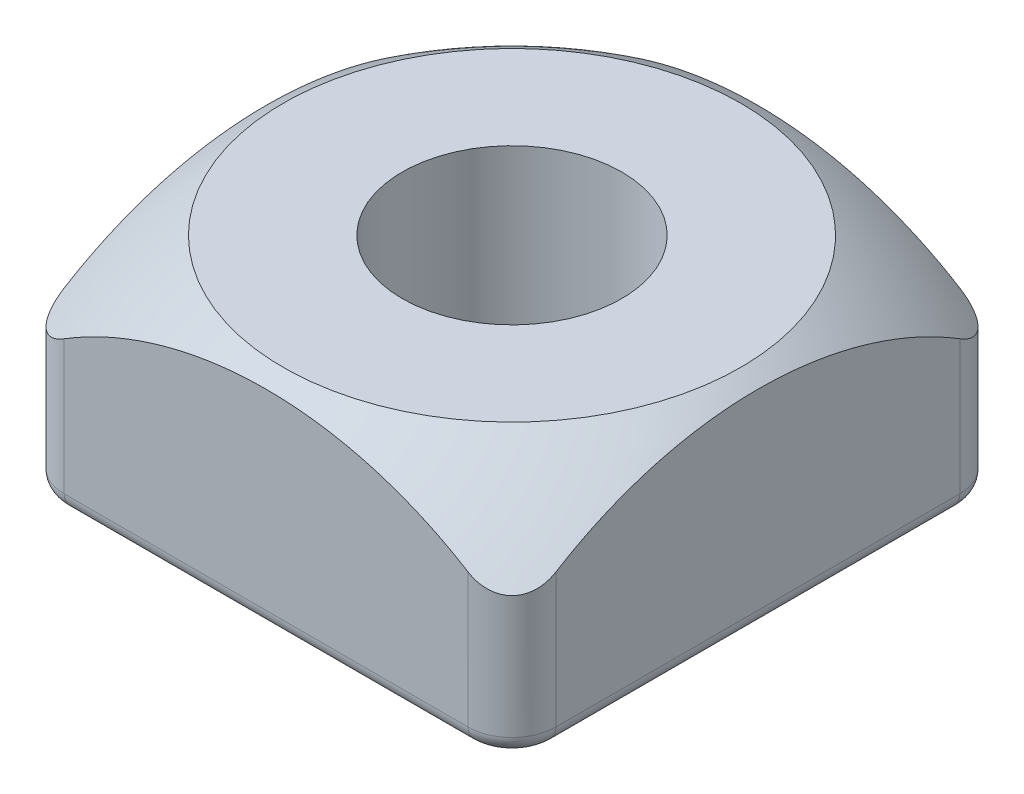
ISO-10303-21;
HEADER;
FILE_DESCRIPTION(('STEP AP214'),'2;1');
FILE_NAME('part.step','',(''),(''),'','','');
FILE_SCHEMA(('AUTOMOTIVE_DESIGN { 1 0 10303 214 1 1 1 1 }'));
ENDSEC;
DATA;
#1=APPLICATION_CONTEXT('core data for automotive mechanical design processes');
#2=APPLICATION_PROTOCOL_DEFINITION('international standard','automotive_design',2000,#1);
#3=PRODUCT_CONTEXT('',#1,'mechanical');
#4=PRODUCT('Part','Part','',(#3));
#5=PRODUCT_RELATED_PRODUCT_CATEGORY('part','',(#4));
#6=PRODUCT_DEFINITION_FORMATION('','',#4);
#7=PRODUCT_DEFINITION_CONTEXT('part definition',#1,'design');
#8=PRODUCT_DEFINITION('design','',#6,#7);
#9=PRODUCT_DEFINITION_SHAPE('','',#8);
#10=(LENGTH_UNIT() NAMED_UNIT(*) SI_UNIT(.MILLI.,.METRE.));
#11=(NAMED_UNIT(*) PLANE_ANGLE_UNIT() SI_UNIT($,.RADIAN.));
#12=(NAMED_UNIT(*) SI_UNIT($,.STERADIAN.) SOLID_ANGLE_UNIT());
#13=UNCERTAINTY_MEASURE_WITH_UNIT(LENGTH_MEASURE(1.E-05),#10,'distance_accuracy_value','');
#14=(GEOMETRIC_REPRESENTATION_CONTEXT(3) GLOBAL_UNCERTAINTY_ASSIGNED_CONTEXT((#13)) GLOBAL_UNIT_ASSIGNED_CONTEXT((#10,
#11,#12)) REPRESENTATION_CONTEXT('',''));
#15=CARTESIAN_POINT('',(0.,0.,0.));
#16=DIRECTION('',(0.,0.,1.));
#17=DIRECTION('',(1.,0.,0.));
#18=AXIS2_PLACEMENT_3D('',#15,#16,#17);
#19=CARTESIAN_POINT('',(-2.8,2.5,2.8));
#20=DIRECTION('',(1.,0.,0.));
#21=DIRECTION('',(0.,0.,-1.));
#22=AXIS2_PLACEMENT_3D('',#19,#20,#21);
#23=PLANE('',#22);
#24=CARTESIAN_POINT('',(-2.8,-2.,0.));
#25=DIRECTION('',(1.,0.,0.));
#26=DIRECTION('',(0.,0.,-1.));
#27=AXIS2_PLACEMENT_3D('',#24,#25,#26);
#28=CIRCLE('',#27,4.38178046004133);
#29=CARTESIAN_POINT('',(-2.8,1.7296112397943,-2.3));
#30=VERTEX_POINT('',#29);
#31=CARTESIAN_POINT('',(-2.8,1.7296112397943,2.3));
#32=VERTEX_POINT('',#31);
#33=EDGE_CURVE('E247',#30,#32,#28,.T.);
#34=ORIENTED_EDGE('',*,*,#33,.F.);
#35=DIRECTION('',(0.,-1.,0.));
#36=VECTOR('',#35,1.);
#37=CARTESIAN_POINT('',(-2.8,2.5,-2.3));
#38=LINE('',#37,#36);
#39=CARTESIAN_POINT('',(-2.8,0.2,-2.3));
#40=VERTEX_POINT('',#39);
#41=EDGE_CURVE('E218',#30,#40,#38,.T.);
#42=ORIENTED_EDGE('',*,*,#41,.T.);
#43=DIRECTION('',(0.,0.,1.));
#44=VECTOR('',#43,1.);
#45=CARTESIAN_POINT('',(-2.8,0.2,2.8));
#46=LINE('',#45,#44);
#47=CARTESIAN_POINT('',(-2.8,0.2,2.3));
#48=VERTEX_POINT('',#47);
#49=EDGE_CURVE('E160',#40,#48,#46,.T.);
#50=ORIENTED_EDGE('',*,*,#49,.T.);
#51=DIRECTION('',(0.,-1.,0.));
#52=VECTOR('',#51,1.);
#53=CARTESIAN_POINT('',(-2.8,2.5,2.3));
#54=LINE('',#53,#52);
#55=EDGE_CURVE('E206',#48,#32,#54,.F.);
#56=ORIENTED_EDGE('',*,*,#55,.T.);
#57=EDGE_LOOP('',(#34,#42,#50,#56));
#58=FACE_BOUND('',#57,.T.);
#59=ADVANCED_FACE('F17',(#58),#23,.F.);
#60=CARTESIAN_POINT('',(2.8,2.5,2.8));
#61=DIRECTION('',(0.,0.,-1.));
#62=DIRECTION('',(-1.,0.,0.));
#63=AXIS2_PLACEMENT_3D('',#60,#61,#62);
#64=PLANE('',#63);
#65=CARTESIAN_POINT('',(0.,-2.,2.8));
#66=DIRECTION('',(0.,0.,-1.));
#67=DIRECTION('',(-1.,0.,0.));
#68=AXIS2_PLACEMENT_3D('',#65,#66,#67);
#69=CIRCLE('',#68,4.38178046004133);
#70=CARTESIAN_POINT('',(-2.3,1.7296112397943,2.8));
#71=VERTEX_POINT('',#70);
#72=CARTESIAN_POINT('',(2.3,1.7296112397943,2.8));
#73=VERTEX_POINT('',#72);
#74=EDGE_CURVE('E38',#71,#73,#69,.T.);
#75=ORIENTED_EDGE('',*,*,#74,.F.);
#76=DIRECTION('',(0.,-1.,0.));
#77=VECTOR('',#76,1.);
#78=CARTESIAN_POINT('',(-2.3,2.5,2.8));
#79=LINE('',#78,#77);
#80=CARTESIAN_POINT('',(-2.3,0.2,2.8));
#81=VERTEX_POINT('',#80);
#82=EDGE_CURVE('E138',#71,#81,#79,.T.);
#83=ORIENTED_EDGE('',*,*,#82,.T.);
#84=DIRECTION('',(1.,0.,0.));
#85=VECTOR('',#84,1.);
#86=CARTESIAN_POINT('',(2.8,0.2,2.8));
#87=LINE('',#86,#85);
#88=CARTESIAN_POINT('',(2.3,0.2,2.8));
#89=VERTEX_POINT('',#88);
#90=EDGE_CURVE('E31',#81,#89,#87,.T.);
#91=ORIENTED_EDGE('',*,*,#90,.T.);
#92=DIRECTION('',(0.,-1.,0.));
#93=VECTOR('',#92,1.);
#94=CARTESIAN_POINT('',(2.3,2.5,2.8));
#95=LINE('',#94,#93);
#96=EDGE_CURVE('E130',#89,#73,#95,.F.);
#97=ORIENTED_EDGE('',*,*,#96,.T.);
#98=EDGE_LOOP('',(#75,#83,#91,#97));
#99=FACE_BOUND('',#98,.T.);
#100=ADVANCED_FACE('F289',(#99),#64,.F.);
#101=CARTESIAN_POINT('',(2.8,2.5,2.8));
#102=DIRECTION('',(-1.,0.,0.));
#103=DIRECTION('',(0.,0.,1.));
#104=AXIS2_PLACEMENT_3D('',#101,#102,#103);
#105=PLANE('',#104);
#106=CARTESIAN_POINT('',(2.8,-2.,0.));
#107=DIRECTION('',(-1.,0.,0.));
#108=DIRECTION('',(0.,0.,1.));
#109=AXIS2_PLACEMENT_3D('',#106,#107,#108);
#110=CIRCLE('',#109,4.38178046004133);
#111=CARTESIAN_POINT('',(2.8,1.72961123979471,2.29999999999933));
#112=VERTEX_POINT('',#111);
#113=CARTESIAN_POINT('',(2.8,1.7296112397943,-2.3));
#114=VERTEX_POINT('',#113);
#115=EDGE_CURVE('E111',#112,#114,#110,.T.);
#116=ORIENTED_EDGE('',*,*,#115,.F.);
#117=DIRECTION('',(0.,-1.,0.));
#118=VECTOR('',#117,1.);
#119=CARTESIAN_POINT('',(2.8,2.5,2.3));
#120=LINE('',#119,#118);
#121=CARTESIAN_POINT('',(2.8,0.2,2.3));
#122=VERTEX_POINT('',#121);
#123=EDGE_CURVE('E118',#112,#122,#120,.T.);
#124=ORIENTED_EDGE('',*,*,#123,.T.);
#125=DIRECTION('',(0.,0.,-1.));
#126=VECTOR('',#125,1.);
#127=CARTESIAN_POINT('',(2.8,0.2,2.8));
#128=LINE('',#127,#126);
#129=CARTESIAN_POINT('',(2.8,0.2,-2.3));
#130=VERTEX_POINT('',#129);
#131=EDGE_CURVE('E170',#122,#130,#128,.T.);
#132=ORIENTED_EDGE('',*,*,#131,.T.);
#133=DIRECTION('',(0.,-1.,0.));
#134=VECTOR('',#133,1.);
#135=CARTESIAN_POINT('',(2.8,2.5,-2.3));
#136=LINE('',#135,#134);
#137=EDGE_CURVE('E121',#130,#114,#136,.F.);
#138=ORIENTED_EDGE('',*,*,#137,.T.);
#139=EDGE_LOOP('',(#116,#124,#132,#138));
#140=FACE_BOUND('',#139,.T.);
#141=ADVANCED_FACE('F117',(#140),#105,.F.);
#142=CARTESIAN_POINT('',(2.8,2.5,-2.8));
#143=DIRECTION('',(0.,0.,1.));
#144=DIRECTION('',(1.,0.,0.));
#145=AXIS2_PLACEMENT_3D('',#142,#143,#144);
#146=PLANE('',#145);
#147=CARTESIAN_POINT('',(0.,-2.,-2.8));
#148=DIRECTION('',(0.,0.,1.));
#149=DIRECTION('',(1.,0.,0.));
#150=AXIS2_PLACEMENT_3D('',#147,#148,#149);
#151=CIRCLE('',#150,4.38178046004133);
#152=CARTESIAN_POINT('',(2.29999999999933,1.72961123979471,-2.8));
#153=VERTEX_POINT('',#152);
#154=CARTESIAN_POINT('',(-2.3,1.7296112397943,-2.8));
#155=VERTEX_POINT('',#154);
#156=EDGE_CURVE('E225',#153,#155,#151,.T.);
#157=ORIENTED_EDGE('',*,*,#156,.F.);
#158=DIRECTION('',(0.,-1.,0.));
#159=VECTOR('',#158,1.);
#160=CARTESIAN_POINT('',(2.3,2.5,-2.8));
#161=LINE('',#160,#159);
#162=CARTESIAN_POINT('',(2.3,0.2,-2.8));
#163=VERTEX_POINT('',#162);
#164=EDGE_CURVE('E133',#153,#163,#161,.T.);
#165=ORIENTED_EDGE('',*,*,#164,.T.);
#166=DIRECTION('',(-1.,0.,0.));
#167=VECTOR('',#166,1.);
#168=CARTESIAN_POINT('',(2.8,0.2,-2.8));
#169=LINE('',#168,#167);
#170=CARTESIAN_POINT('',(-2.3,0.2,-2.8));
#171=VERTEX_POINT('',#170);
#172=EDGE_CURVE('E165',#163,#171,#169,.T.);
#173=ORIENTED_EDGE('',*,*,#172,.T.);
#174=DIRECTION('',(0.,-1.,0.));
#175=VECTOR('',#174,1.);
#176=CARTESIAN_POINT('',(-2.3,2.5,-2.8));
#177=LINE('',#176,#175);
#178=EDGE_CURVE('E128',#171,#155,#177,.F.);
#179=ORIENTED_EDGE('',*,*,#178,.T.);
#180=EDGE_LOOP('',(#157,#165,#173,#179));
#181=FACE_BOUND('',#180,.T.);
#182=ADVANCED_FACE('F222',(#181),#146,.F.);
#183=CARTESIAN_POINT('',(0.,2.5,0.));
#184=DIRECTION('',(0.,1.,0.));
#185=DIRECTION('',(0.,0.,1.));
#186=AXIS2_PLACEMENT_3D('',#183,#184,#185);
#187=PLANE('',#186);
#188=CARTESIAN_POINT('',(0.,2.5,0.));
#189=DIRECTION('',(0.,-1.,0.));
#190=DIRECTION('',(0.,0.,-1.));
#191=AXIS2_PLACEMENT_3D('',#188,#189,#190);
#192=CIRCLE('',#191,1.25);
#193=CARTESIAN_POINT('',(0.,2.5,-1.25));
#194=VERTEX_POINT('',#193);
#195=EDGE_CURVE('E201',#194,#194,#192,.T.);
#196=ORIENTED_EDGE('',*,*,#195,.T.);
#197=EDGE_LOOP('',(#196));
#198=FACE_BOUND('',#197,.T.);
#199=CARTESIAN_POINT('',(0.,2.5,0.));
#200=DIRECTION('',(0.,-1.,0.));
#201=DIRECTION('',(0.,0.,-1.));
#202=AXIS2_PLACEMENT_3D('',#199,#200,#201);
#203=CIRCLE('',#202,2.60576284415907);
#204=CARTESIAN_POINT('',(0.,2.5,-2.60576284415907));
#205=VERTEX_POINT('',#204);
#206=EDGE_CURVE('E122',#205,#205,#203,.T.);
#207=ORIENTED_EDGE('',*,*,#206,.F.);
#208=EDGE_LOOP('',(#207));
#209=FACE_BOUND('',#208,.T.);
#210=ADVANCED_FACE('F278',(#198,#209),#187,.T.);
#211=CARTESIAN_POINT('',(-2.3,2.5,-2.3));
#212=DIRECTION('',(0.,-1.,0.));
#213=DIRECTION('',(0.,0.,-1.));
#214=AXIS2_PLACEMENT_3D('',#211,#212,#213);
#215=CYLINDRICAL_SURFACE('',#214,0.5);
#216=ORIENTED_EDGE('',*,*,#41,.F.);
#217=CARTESIAN_POINT('',(-2.79999996,1.72973459967327,-2.2998));
#218=CARTESIAN_POINT('',(-2.80001674026759,1.71485604779938,-2.32391629645797));
#219=CARTESIAN_POINT('',(-2.79827213613602,1.70063715969748,-2.34856823224164));
#220=CARTESIAN_POINT('',(-2.79084882930298,1.67409846060162,-2.39853628498898));
#221=CARTESIAN_POINT('',(-2.78513913144629,1.66179455312283,-2.4238561121894));
#222=CARTESIAN_POINT('',(-2.77071710956082,1.64180176811019,-2.47001412259672));
#223=CARTESIAN_POINT('',(-2.76268927379089,1.63368317232618,-2.49087483460717));
#224=CARTESIAN_POINT('',(-2.74354683886918,1.61980742701657,-2.53189710991841));
#225=CARTESIAN_POINT('',(-2.73244172630072,1.61404315261143,-2.55206061106917));
#226=CARTESIAN_POINT('',(-2.70710936862176,1.60523291808552,-2.59122014457657));
#227=CARTESIAN_POINT('',(-2.69285911141434,1.60220787915642,-2.61020617678105));
#228=CARTESIAN_POINT('',(-2.66164314597201,1.59922550081526,-2.64609127363901));
#229=CARTESIAN_POINT('',(-2.64467693903247,1.59926872544608,-2.66298995399993));
#230=CARTESIAN_POINT('',(-2.61069599890266,1.60223929377957,-2.69231997894915));
#231=CARTESIAN_POINT('',(-2.5938989171842,1.60484353104792,-2.70503957994039));
#232=CARTESIAN_POINT('',(-2.55920270940804,1.61227626487139,-2.7280742122055));
#233=CARTESIAN_POINT('',(-2.54130385727382,1.61710421048505,-2.73838983813054));
#234=CARTESIAN_POINT('',(-2.5042484928843,1.62889891811767,-2.75686636406759));
#235=CARTESIAN_POINT('',(-2.4850698961965,1.63593605568066,-2.76493691429168));
#236=CARTESIAN_POINT('',(-2.44648808280231,1.6517292776996,-2.77849793156779));
#237=CARTESIAN_POINT('',(-2.4270845673129,1.66048797576882,-2.78398443205017));
#238=CARTESIAN_POINT('',(-2.38946167857995,1.67886240612346,-2.79228848308946));
#239=CARTESIAN_POINT('',(-2.37123460637291,1.68840698681815,-2.79523338613568));
#240=CARTESIAN_POINT('',(-2.33518821639143,1.70842727421035,-2.79908758510914));
#241=CARTESIAN_POINT('',(-2.31736737874264,1.71889836753124,-2.80000643494376));
#242=CARTESIAN_POINT('',(-2.2998,1.72973459967327,-2.79999996));
#243=B_SPLINE_CURVE_WITH_KNOTS('',3,(#217,#218,#219,#220,#221,#222,#223,#224,#225,#226,#227,
#228,#229,#230,#231,#232,#233,#234,#235,#236,#237,#238,#239,#240,#241,#242),.UNSPECIFIED.,.F.,
.F.,(4,2,2,2,2,2,2,2,2,2,2,2,4),(0.,0.0851166478882209,0.17090625453535,0.241955237160982,
0.31278758210848,0.384156461955695,0.455538461671273,0.518936953109826,0.582319745509077,
0.647971415828669,0.713723536985189,0.775949471414008,0.837881344586908),.UNSPECIFIED.);
#244=EDGE_CURVE('E177',#30,#155,#243,.T.);
#245=ORIENTED_EDGE('',*,*,#244,.T.);
#246=ORIENTED_EDGE('',*,*,#178,.F.);
#247=CARTESIAN_POINT('',(-2.3,0.2,-2.3));
#248=DIRECTION('',(0.,1.,0.));
#249=DIRECTION('',(0.,0.,1.));
#250=AXIS2_PLACEMENT_3D('',#247,#248,#249);
#251=CIRCLE('',#250,0.5);
#252=EDGE_CURVE('E162',#171,#40,#251,.T.);
#253=ORIENTED_EDGE('',*,*,#252,.T.);
#254=EDGE_LOOP('',(#216,#245,#246,#253));
#255=FACE_BOUND('',#254,.T.);
#256=ADVANCED_FACE('F244',(#255),#215,.T.);
#257=CARTESIAN_POINT('',(2.3,2.5,-2.3));
#258=DIRECTION('',(0.,-1.,0.));
#259=DIRECTION('',(0.,0.,-1.));
#260=AXIS2_PLACEMENT_3D('',#257,#258,#259);
#261=CYLINDRICAL_SURFACE('',#260,0.5);
#262=ORIENTED_EDGE('',*,*,#164,.F.);
#263=CARTESIAN_POINT('',(2.2998,1.72973459967327,-2.79999996));
#264=CARTESIAN_POINT('',(2.32391629645797,1.71485604779938,-2.80001674026759));
#265=CARTESIAN_POINT('',(2.34856823224164,1.70063715969748,-2.79827213613602));
#266=CARTESIAN_POINT('',(2.39853628498898,1.67409846060162,-2.79084882930298));
#267=CARTESIAN_POINT('',(2.4238561121894,1.66179455312283,-2.78513913144629));
#268=CARTESIAN_POINT('',(2.47001412259672,1.64180176811019,-2.77071710956082));
#269=CARTESIAN_POINT('',(2.49087483460717,1.63368317232619,-2.76268927379089));
#270=CARTESIAN_POINT('',(2.53189710991841,1.61980742701657,-2.74354683886918));
#271=CARTESIAN_POINT('',(2.55206061106917,1.61404315261143,-2.73244172630072));
#272=CARTESIAN_POINT('',(2.59122014457657,1.60523291808552,-2.70710936862176));
#273=CARTESIAN_POINT('',(2.61020617678104,1.60220787915643,-2.69285911141434));
#274=CARTESIAN_POINT('',(2.64609127363901,1.59922550081526,-2.66164314597201));
#275=CARTESIAN_POINT('',(2.66298995399993,1.59926872544608,-2.64467693903248));
#276=CARTESIAN_POINT('',(2.69231997894915,1.60223929377957,-2.61069599890266));
#277=CARTESIAN_POINT('',(2.70503957994039,1.60484353104792,-2.5938989171842));
#278=CARTESIAN_POINT('',(2.72807421220549,1.6122762648714,-2.55920270940804));
#279=CARTESIAN_POINT('',(2.73838983813053,1.61710421048505,-2.54130385727382));
#280=CARTESIAN_POINT('',(2.75686636406759,1.62889891811767,-2.5042484928843));
#281=CARTESIAN_POINT('',(2.76493691429168,1.63593605568067,-2.4850698961965));
#282=CARTESIAN_POINT('',(2.77849793156779,1.6517292776996,-2.44648808280231));
#283=CARTESIAN_POINT('',(2.78398443205017,1.66048797576882,-2.4270845673129));
#284=CARTESIAN_POINT('',(2.79228848308946,1.67886240612346,-2.38946167857995));
#285=CARTESIAN_POINT('',(2.79523338613568,1.68840698681816,-2.37123460637291));
#286=CARTESIAN_POINT('',(2.79908758510914,1.70842727421035,-2.33518821639143));
#287=CARTESIAN_POINT('',(2.80000643494376,1.71889836753124,-2.31736737874264));
#288=CARTESIAN_POINT('',(2.79999996,1.72973459967327,-2.2998));
#289=B_SPLINE_CURVE_WITH_KNOTS('',3,(#263,#264,#265,#266,#267,#268,#269,#270,#271,#272,#273,
#274,#275,#276,#277,#278,#279,#280,#281,#282,#283,#284,#285,#286,#287,#288),.UNSPECIFIED.,.F.,
.F.,(4,2,2,2,2,2,2,2,2,2,2,2,4),(0.,0.0851166478882218,0.17090625453535,0.241955237160982,
0.31278758210848,0.384156461955693,0.455538461671269,0.518936953109824,0.582319745509077,
0.647971415828669,0.713723536985189,0.775949471414007,0.837881344586908),.UNSPECIFIED.);
#290=EDGE_CURVE('E249',#153,#114,#289,.T.);
#291=ORIENTED_EDGE('',*,*,#290,.T.);
#292=ORIENTED_EDGE('',*,*,#137,.F.);
#293=CARTESIAN_POINT('',(2.3,0.2,-2.3));
#294=DIRECTION('',(0.,1.,0.));
#295=DIRECTION('',(0.,0.,1.));
#296=AXIS2_PLACEMENT_3D('',#293,#294,#295);
#297=CIRCLE('',#296,0.5);
#298=EDGE_CURVE('E167',#130,#163,#297,.T.);
#299=ORIENTED_EDGE('',*,*,#298,.T.);
#300=EDGE_LOOP('',(#262,#291,#292,#299));
#301=FACE_BOUND('',#300,.T.);
#302=ADVANCED_FACE('F229',(#301),#261,.T.);
#303=CARTESIAN_POINT('',(-2.3,2.5,2.3));
#304=DIRECTION('',(0.,-1.,0.));
#305=DIRECTION('',(0.,0.,-1.));
#306=AXIS2_PLACEMENT_3D('',#303,#304,#305);
#307=CYLINDRICAL_SURFACE('',#306,0.5);
#308=ORIENTED_EDGE('',*,*,#82,.F.);
#309=CARTESIAN_POINT('',(-2.2998,1.72973459967327,2.79999996));
#310=CARTESIAN_POINT('',(-2.32391629645797,1.71485604779938,2.80001674026759));
#311=CARTESIAN_POINT('',(-2.34856823224164,1.70063715969747,2.79827213613602));
#312=CARTESIAN_POINT('',(-2.39853628498898,1.67409846060162,2.79084882930298));
#313=CARTESIAN_POINT('',(-2.42385611218941,1.66179455312283,2.78513913144629));
#314=CARTESIAN_POINT('',(-2.47001412259673,1.64180176811019,2.77071710956082));
#315=CARTESIAN_POINT('',(-2.49087483460718,1.63368317232618,2.76268927379088));
#316=CARTESIAN_POINT('',(-2.53189710991841,1.61980742701656,2.74354683886918));
#317=CARTESIAN_POINT('',(-2.55206061106917,1.61404315261143,2.73244172630072));
#318=CARTESIAN_POINT('',(-2.59122014457657,1.60523291808552,2.70710936862176));
#319=CARTESIAN_POINT('',(-2.61020617678104,1.60220787915642,2.69285911141434));
#320=CARTESIAN_POINT('',(-2.64609127363901,1.59922550081526,2.66164314597201));
#321=CARTESIAN_POINT('',(-2.66298995399993,1.59926872544609,2.64467693903248));
#322=CARTESIAN_POINT('',(-2.69231997894915,1.60223929377957,2.61069599890266));
#323=CARTESIAN_POINT('',(-2.70503957994039,1.60484353104792,2.5938989171842));
#324=CARTESIAN_POINT('',(-2.72807421220549,1.61227626487139,2.55920270940804));
#325=CARTESIAN_POINT('',(-2.73838983813053,1.61710421048504,2.54130385727382));
#326=CARTESIAN_POINT('',(-2.75686636406759,1.62889891811767,2.5042484928843));
#327=CARTESIAN_POINT('',(-2.76493691429168,1.63593605568066,2.4850698961965));
#328=CARTESIAN_POINT('',(-2.77849793156779,1.6517292776996,2.44648808280231));
#329=CARTESIAN_POINT('',(-2.78398443205017,1.66048797576882,2.4270845673129));
#330=CARTESIAN_POINT('',(-2.79228848308946,1.67886240612346,2.38946167857995));
#331=CARTESIAN_POINT('',(-2.79523338613568,1.68840698681815,2.37123460637291));
#332=CARTESIAN_POINT('',(-2.79908758510914,1.70842727421035,2.33518821639143));
#333=CARTESIAN_POINT('',(-2.80000643494376,1.71889836753124,2.31736737874264));
#334=CARTESIAN_POINT('',(-2.79999996,1.72973459967327,2.2998));
#335=B_SPLINE_CURVE_WITH_KNOTS('',3,(#309,#310,#311,#312,#313,#314,#315,#316,#317,#318,#319,
#320,#321,#322,#323,#324,#325,#326,#327,#328,#329,#330,#331,#332,#333,#334),.UNSPECIFIED.,.F.,
.F.,(4,2,2,2,2,2,2,2,2,2,2,2,4),(0.,0.0851166478882242,0.170906254535354,0.241955237160984,
0.31278758210848,0.384156461955693,0.455538461671269,0.518936953109825,0.582319745509078,
0.64797141582867,0.71372353698519,0.775949471414008,0.837881344586909),.UNSPECIFIED.);
#336=EDGE_CURVE('E258',#71,#32,#335,.T.);
#337=ORIENTED_EDGE('',*,*,#336,.T.);
#338=ORIENTED_EDGE('',*,*,#55,.F.);
#339=CARTESIAN_POINT('',(-2.3,0.2,2.3));
#340=DIRECTION('',(0.,1.,0.));
#341=DIRECTION('',(0.,0.,1.));
#342=AXIS2_PLACEMENT_3D('',#339,#340,#341);
#343=CIRCLE('',#342,0.5);
#344=EDGE_CURVE('E157',#48,#81,#343,.T.);
#345=ORIENTED_EDGE('',*,*,#344,.T.);
#346=EDGE_LOOP('',(#308,#337,#338,#345));
#347=FACE_BOUND('',#346,.T.);
#348=ADVANCED_FACE('F301',(#347),#307,.T.);
#349=CARTESIAN_POINT('',(2.3,2.5,2.3));
#350=DIRECTION('',(0.,-1.,0.));
#351=DIRECTION('',(0.,0.,-1.));
#352=AXIS2_PLACEMENT_3D('',#349,#350,#351);
#353=CYLINDRICAL_SURFACE('',#352,0.5);
#354=ORIENTED_EDGE('',*,*,#123,.F.);
#355=CARTESIAN_POINT('',(2.79999996,1.72973459967327,2.2998));
#356=CARTESIAN_POINT('',(2.80001674026759,1.71485604779938,2.32391629645797));
#357=CARTESIAN_POINT('',(2.79827213613602,1.70063715969748,2.34856823224164));
#358=CARTESIAN_POINT('',(2.79084882930298,1.67409846060162,2.39853628498898));
#359=CARTESIAN_POINT('',(2.78513913144629,1.66179455312283,2.4238561121894));
#360=CARTESIAN_POINT('',(2.77071710956082,1.64180176811019,2.47001412259672));
#361=CARTESIAN_POINT('',(2.76268927379089,1.63368317232619,2.49087483460717));
#362=CARTESIAN_POINT('',(2.74354683886918,1.61980742701657,2.53189710991841));
#363=CARTESIAN_POINT('',(2.73244172630072,1.61404315261143,2.55206061106917));
#364=CARTESIAN_POINT('',(2.70710936862176,1.60523291808551,2.59122014457657));
#365=CARTESIAN_POINT('',(2.69285911141434,1.60220787915642,2.61020617678105));
#366=CARTESIAN_POINT('',(2.66164314597201,1.59922550081526,2.64609127363901));
#367=CARTESIAN_POINT('',(2.64467693903247,1.59926872544608,2.66298995399993));
#368=CARTESIAN_POINT('',(2.61069599890266,1.60223929377957,2.69231997894915));
#369=CARTESIAN_POINT('',(2.5938989171842,1.60484353104792,2.70503957994039));
#370=CARTESIAN_POINT('',(2.55920270940804,1.61227626487139,2.7280742122055));
#371=CARTESIAN_POINT('',(2.54130385727382,1.61710421048505,2.73838983813054));
#372=CARTESIAN_POINT('',(2.5042484928843,1.62889891811767,2.75686636406759));
#373=CARTESIAN_POINT('',(2.4850698961965,1.63593605568067,2.76493691429168));
#374=CARTESIAN_POINT('',(2.44648808280231,1.6517292776996,2.77849793156779));
#375=CARTESIAN_POINT('',(2.4270845673129,1.66048797576882,2.78398443205017));
#376=CARTESIAN_POINT('',(2.38946167857995,1.67886240612346,2.79228848308946));
#377=CARTESIAN_POINT('',(2.37123460637291,1.68840698681816,2.79523338613568));
#378=CARTESIAN_POINT('',(2.33518821639143,1.70842727421035,2.79908758510914));
#379=CARTESIAN_POINT('',(2.31736737874264,1.71889836753124,2.80000643494376));
#380=CARTESIAN_POINT('',(2.2998,1.72973459967327,2.79999996));
#381=B_SPLINE_CURVE_WITH_KNOTS('',3,(#355,#356,#357,#358,#359,#360,#361,#362,#363,#364,#365,
#366,#367,#368,#369,#370,#371,#372,#373,#374,#375,#376,#377,#378,#379,#380),.UNSPECIFIED.,.F.,
.F.,(4,2,2,2,2,2,2,2,2,2,2,2,4),(0.,0.0851166478882208,0.17090625453535,0.241955237160982,
0.31278758210848,0.384156461955695,0.455538461671273,0.518936953109826,0.582319745509077,
0.647971415828669,0.713723536985189,0.775949471414007,0.837881344586908),.UNSPECIFIED.);
#382=EDGE_CURVE('E11',#112,#73,#381,.T.);
#383=ORIENTED_EDGE('',*,*,#382,.T.);
#384=ORIENTED_EDGE('',*,*,#96,.F.);
#385=CARTESIAN_POINT('',(2.3,0.2,2.3));
#386=DIRECTION('',(0.,1.,0.));
#387=DIRECTION('',(0.,0.,1.));
#388=AXIS2_PLACEMENT_3D('',#385,#386,#387);
#389=CIRCLE('',#388,0.5);
#390=EDGE_CURVE('E126',#89,#122,#389,.T.);
#391=ORIENTED_EDGE('',*,*,#390,.T.);
#392=EDGE_LOOP('',(#354,#383,#384,#391));
#393=FACE_BOUND('',#392,.T.);
#394=ADVANCED_FACE('F124',(#393),#353,.T.);
#395=CARTESIAN_POINT('',(0.,0.,0.));
#396=DIRECTION('',(0.,1.,0.));
#397=DIRECTION('',(0.,0.,1.));
#398=AXIS2_PLACEMENT_3D('',#395,#396,#397);
#399=PLANE('',#398);
#400=DIRECTION('',(1.,0.,0.));
#401=VECTOR('',#400,1.);
#402=CARTESIAN_POINT('',(0.,0.,2.6));
#403=LINE('',#402,#401);
#404=CARTESIAN_POINT('',(2.3,0.,2.6));
#405=VERTEX_POINT('',#404);
#406=CARTESIAN_POINT('',(-2.3,0.,2.6));
#407=VERTEX_POINT('',#406);
#408=EDGE_CURVE('E140',#405,#407,#403,.F.);
#409=ORIENTED_EDGE('',*,*,#408,.T.);
#410=CARTESIAN_POINT('',(-2.3,0.,2.3));
#411=DIRECTION('',(0.,1.,0.));
#412=DIRECTION('',(0.,0.,1.));
#413=AXIS2_PLACEMENT_3D('',#410,#411,#412);
#414=CIRCLE('',#413,0.3);
#415=CARTESIAN_POINT('',(-2.6,0.,2.3));
#416=VERTEX_POINT('',#415);
#417=EDGE_CURVE('E154',#407,#416,#414,.F.);
#418=ORIENTED_EDGE('',*,*,#417,.T.);
#419=DIRECTION('',(0.,0.,1.));
#420=VECTOR('',#419,1.);
#421=CARTESIAN_POINT('',(-2.6,0.,0.));
#422=LINE('',#421,#420);
#423=CARTESIAN_POINT('',(-2.6,0.,-2.3));
#424=VERTEX_POINT('',#423);
#425=EDGE_CURVE('E152',#416,#424,#422,.F.);
#426=ORIENTED_EDGE('',*,*,#425,.T.);
#427=CARTESIAN_POINT('',(-2.3,0.,-2.3));
#428=DIRECTION('',(0.,1.,0.));
#429=DIRECTION('',(0.,0.,1.));
#430=AXIS2_PLACEMENT_3D('',#427,#428,#429);
#431=CIRCLE('',#430,0.3);
#432=CARTESIAN_POINT('',(-2.3,0.,-2.6));
#433=VERTEX_POINT('',#432);
#434=EDGE_CURVE('E150',#424,#433,#431,.F.);
#435=ORIENTED_EDGE('',*,*,#434,.T.);
#436=DIRECTION('',(-1.,0.,0.));
#437=VECTOR('',#436,1.);
#438=CARTESIAN_POINT('',(0.,0.,-2.6));
#439=LINE('',#438,#437);
#440=CARTESIAN_POINT('',(2.3,0.,-2.6));
#441=VERTEX_POINT('',#440);
#442=EDGE_CURVE('E148',#433,#441,#439,.F.);
#443=ORIENTED_EDGE('',*,*,#442,.T.);
#444=CARTESIAN_POINT('',(2.3,0.,-2.3));
#445=DIRECTION('',(0.,1.,0.));
#446=DIRECTION('',(0.,0.,1.));
#447=AXIS2_PLACEMENT_3D('',#444,#445,#446);
#448=CIRCLE('',#447,0.3);
#449=CARTESIAN_POINT('',(2.6,0.,-2.3));
#450=VERTEX_POINT('',#449);
#451=EDGE_CURVE('E146',#441,#450,#448,.F.);
#452=ORIENTED_EDGE('',*,*,#451,.T.);
#453=DIRECTION('',(0.,0.,-1.));
#454=VECTOR('',#453,1.);
#455=CARTESIAN_POINT('',(2.6,0.,0.));
#456=LINE('',#455,#454);
#457=CARTESIAN_POINT('',(2.6,0.,2.3));
#458=VERTEX_POINT('',#457);
#459=EDGE_CURVE('E144',#450,#458,#456,.F.);
#460=ORIENTED_EDGE('',*,*,#459,.T.);
#461=CARTESIAN_POINT('',(2.3,0.,2.3));
#462=DIRECTION('',(0.,1.,0.));
#463=DIRECTION('',(0.,0.,1.));
#464=AXIS2_PLACEMENT_3D('',#461,#462,#463);
#465=CIRCLE('',#464,0.3);
#466=EDGE_CURVE('E142',#458,#405,#465,.F.);
#467=ORIENTED_EDGE('',*,*,#466,.T.);
#468=EDGE_LOOP('',(#409,#418,#426,#435,#443,#452,#460,#467));
#469=FACE_BOUND('',#468,.T.);
#470=CARTESIAN_POINT('',(0.,0.,0.));
#471=DIRECTION('',(0.,-1.,0.));
#472=DIRECTION('',(0.,0.,-1.));
#473=AXIS2_PLACEMENT_3D('',#470,#471,#472);
#474=CIRCLE('',#473,1.25);
#475=CARTESIAN_POINT('',(0.,0.,-1.25));
#476=VERTEX_POINT('',#475);
#477=EDGE_CURVE('E196',#476,#476,#474,.T.);
#478=ORIENTED_EDGE('',*,*,#477,.F.);
#479=EDGE_LOOP('',(#478));
#480=FACE_BOUND('',#479,.T.);
#481=ADVANCED_FACE('F276',(#469,#480),#399,.F.);
#482=CARTESIAN_POINT('',(0.,0.,0.));
#483=DIRECTION('',(0.,-1.,0.));
#484=DIRECTION('',(0.,0.,-1.));
#485=AXIS2_PLACEMENT_3D('',#482,#483,#484);
#486=CYLINDRICAL_SURFACE('',#485,1.25);
#487=ORIENTED_EDGE('',*,*,#195,.F.);
#488=EDGE_LOOP('',(#487));
#489=FACE_BOUND('',#488,.T.);
#490=ORIENTED_EDGE('',*,*,#477,.T.);
#491=EDGE_LOOP('',(#490));
#492=FACE_BOUND('',#491,.T.);
#493=ADVANCED_FACE('F270',(#489,#492),#486,.F.);
#494=CARTESIAN_POINT('',(2.3,0.2,-2.3));
#495=DIRECTION('',(0.,1.,0.));
#496=DIRECTION('',(0.,0.,1.));
#497=AXIS2_PLACEMENT_3D('',#494,#495,#496);
#498=TOROIDAL_SURFACE('',#497,0.3,0.2);
#499=CARTESIAN_POINT('',(2.3,0.2,-2.6));
#500=DIRECTION('',(-1.,0.,0.));
#501=DIRECTION('',(0.,0.,1.));
#502=AXIS2_PLACEMENT_3D('',#499,#500,#501);
#503=CIRCLE('',#502,0.2);
#504=EDGE_CURVE('E192',#163,#441,#503,.T.);
#505=ORIENTED_EDGE('',*,*,#504,.F.);
#506=ORIENTED_EDGE('',*,*,#298,.F.);
#507=CARTESIAN_POINT('',(2.6,0.2,-2.3));
#508=DIRECTION('',(0.,0.,1.));
#509=DIRECTION('',(1.,0.,0.));
#510=AXIS2_PLACEMENT_3D('',#507,#508,#509);
#511=CIRCLE('',#510,0.2);
#512=EDGE_CURVE('E194',#450,#130,#511,.T.);
#513=ORIENTED_EDGE('',*,*,#512,.F.);
#514=ORIENTED_EDGE('',*,*,#451,.F.);
#515=EDGE_LOOP('',(#505,#506,#513,#514));
#516=FACE_BOUND('',#515,.T.);
#517=ADVANCED_FACE('F19',(#516),#498,.T.);
#518=CARTESIAN_POINT('',(2.6,0.2,2.8));
#519=DIRECTION('',(0.,0.,-1.));
#520=DIRECTION('',(-1.,0.,0.));
#521=AXIS2_PLACEMENT_3D('',#518,#519,#520);
#522=CYLINDRICAL_SURFACE('',#521,0.2);
#523=ORIENTED_EDGE('',*,*,#512,.T.);
#524=ORIENTED_EDGE('',*,*,#131,.F.);
#525=CARTESIAN_POINT('',(2.6,0.2,2.3));
#526=DIRECTION('',(0.,0.,1.));
#527=DIRECTION('',(1.,0.,0.));
#528=AXIS2_PLACEMENT_3D('',#525,#526,#527);
#529=CIRCLE('',#528,0.2);
#530=EDGE_CURVE('E189',#458,#122,#529,.T.);
#531=ORIENTED_EDGE('',*,*,#530,.F.);
#532=ORIENTED_EDGE('',*,*,#459,.F.);
#533=EDGE_LOOP('',(#523,#524,#531,#532));
#534=FACE_BOUND('',#533,.T.);
#535=ADVANCED_FACE('F333',(#534),#522,.T.);
#536=CARTESIAN_POINT('',(2.8,0.2,-2.6));
#537=DIRECTION('',(-1.,0.,0.));
#538=DIRECTION('',(0.,0.,1.));
#539=AXIS2_PLACEMENT_3D('',#536,#537,#538);
#540=CYLINDRICAL_SURFACE('',#539,0.2);
#541=ORIENTED_EDGE('',*,*,#504,.T.);
#542=ORIENTED_EDGE('',*,*,#442,.F.);
#543=CARTESIAN_POINT('',(-2.3,0.2,-2.6));
#544=DIRECTION('',(-1.,0.,0.));
#545=DIRECTION('',(0.,0.,1.));
#546=AXIS2_PLACEMENT_3D('',#543,#544,#545);
#547=CIRCLE('',#546,0.2);
#548=EDGE_CURVE('E186',#171,#433,#547,.T.);
#549=ORIENTED_EDGE('',*,*,#548,.F.);
#550=ORIENTED_EDGE('',*,*,#172,.F.);
#551=EDGE_LOOP('',(#541,#542,#549,#550));
#552=FACE_BOUND('',#551,.T.);
#553=ADVANCED_FACE('F235',(#552),#540,.T.);
#554=CARTESIAN_POINT('',(2.3,0.2,2.3));
#555=DIRECTION('',(0.,1.,0.));
#556=DIRECTION('',(0.,0.,1.));
#557=AXIS2_PLACEMENT_3D('',#554,#555,#556);
#558=TOROIDAL_SURFACE('',#557,0.3,0.2);
#559=ORIENTED_EDGE('',*,*,#530,.T.);
#560=ORIENTED_EDGE('',*,*,#390,.F.);
#561=CARTESIAN_POINT('',(2.3,0.2,2.6));
#562=DIRECTION('',(-1.,0.,0.));
#563=DIRECTION('',(0.,0.,1.));
#564=AXIS2_PLACEMENT_3D('',#561,#562,#563);
#565=CIRCLE('',#564,0.2);
#566=EDGE_CURVE('E183',#405,#89,#565,.T.);
#567=ORIENTED_EDGE('',*,*,#566,.F.);
#568=ORIENTED_EDGE('',*,*,#466,.F.);
#569=EDGE_LOOP('',(#559,#560,#567,#568));
#570=FACE_BOUND('',#569,.T.);
#571=ADVANCED_FACE('F328',(#570),#558,.T.);
#572=CARTESIAN_POINT('',(-2.3,0.2,-2.3));
#573=DIRECTION('',(0.,1.,0.));
#574=DIRECTION('',(0.,0.,1.));
#575=AXIS2_PLACEMENT_3D('',#572,#573,#574);
#576=TOROIDAL_SURFACE('',#575,0.3,0.2);
#577=ORIENTED_EDGE('',*,*,#548,.T.);
#578=ORIENTED_EDGE('',*,*,#434,.F.);
#579=CARTESIAN_POINT('',(-2.6,0.2,-2.3));
#580=DIRECTION('',(0.,0.,1.));
#581=DIRECTION('',(1.,0.,0.));
#582=AXIS2_PLACEMENT_3D('',#579,#580,#581);
#583=CIRCLE('',#582,0.2);
#584=EDGE_CURVE('E180',#40,#424,#583,.T.);
#585=ORIENTED_EDGE('',*,*,#584,.F.);
#586=ORIENTED_EDGE('',*,*,#252,.F.);
#587=EDGE_LOOP('',(#577,#578,#585,#586));
#588=FACE_BOUND('',#587,.T.);
#589=ADVANCED_FACE('F240',(#588),#576,.T.);
#590=CARTESIAN_POINT('',(2.8,0.2,2.6));
#591=DIRECTION('',(1.,0.,0.));
#592=DIRECTION('',(0.,0.,-1.));
#593=AXIS2_PLACEMENT_3D('',#590,#591,#592);
#594=CYLINDRICAL_SURFACE('',#593,0.2);
#595=ORIENTED_EDGE('',*,*,#566,.T.);
#596=ORIENTED_EDGE('',*,*,#90,.F.);
#597=CARTESIAN_POINT('',(-2.3,0.2,2.6));
#598=DIRECTION('',(-1.,0.,0.));
#599=DIRECTION('',(0.,0.,1.));
#600=AXIS2_PLACEMENT_3D('',#597,#598,#599);
#601=CIRCLE('',#600,0.2);
#602=EDGE_CURVE('E176',#407,#81,#601,.T.);
#603=ORIENTED_EDGE('',*,*,#602,.F.);
#604=ORIENTED_EDGE('',*,*,#408,.F.);
#605=EDGE_LOOP('',(#595,#596,#603,#604));
#606=FACE_BOUND('',#605,.T.);
#607=ADVANCED_FACE('F321',(#606),#594,.T.);
#608=CARTESIAN_POINT('',(-2.6,0.2,2.8));
#609=DIRECTION('',(0.,0.,1.));
#610=DIRECTION('',(1.,0.,0.));
#611=AXIS2_PLACEMENT_3D('',#608,#609,#610);
#612=CYLINDRICAL_SURFACE('',#611,0.2);
#613=ORIENTED_EDGE('',*,*,#584,.T.);
#614=ORIENTED_EDGE('',*,*,#425,.F.);
#615=CARTESIAN_POINT('',(-2.6,0.2,2.3));
#616=DIRECTION('',(0.,0.,1.));
#617=DIRECTION('',(1.,0.,0.));
#618=AXIS2_PLACEMENT_3D('',#615,#616,#617);
#619=CIRCLE('',#618,0.2);
#620=EDGE_CURVE('E174',#48,#416,#619,.T.);
#621=ORIENTED_EDGE('',*,*,#620,.F.);
#622=ORIENTED_EDGE('',*,*,#49,.F.);
#623=EDGE_LOOP('',(#613,#614,#621,#622));
#624=FACE_BOUND('',#623,.T.);
#625=ADVANCED_FACE('F317',(#624),#612,.T.);
#626=CARTESIAN_POINT('',(-2.3,0.2,2.3));
#627=DIRECTION('',(0.,1.,0.));
#628=DIRECTION('',(0.,0.,1.));
#629=AXIS2_PLACEMENT_3D('',#626,#627,#628);
#630=TOROIDAL_SURFACE('',#629,0.3,0.2);
#631=ORIENTED_EDGE('',*,*,#602,.T.);
#632=ORIENTED_EDGE('',*,*,#344,.F.);
#633=ORIENTED_EDGE('',*,*,#620,.T.);
#634=ORIENTED_EDGE('',*,*,#417,.F.);
#635=EDGE_LOOP('',(#631,#632,#633,#634));
#636=FACE_BOUND('',#635,.T.);
#637=ADVANCED_FACE('F269',(#636),#630,.T.);
#638=CARTESIAN_POINT('',(0.,-2.,0.));
#639=DIRECTION('',(0.,-1.,0.));
#640=DIRECTION('',(-1.,0.,0.));
#641=AXIS2_PLACEMENT_3D('',#638,#639,#640);
#642=SPHERICAL_SURFACE('',#641,5.2);
#643=ORIENTED_EDGE('',*,*,#33,.T.);
#644=ORIENTED_EDGE('',*,*,#336,.F.);
#645=ORIENTED_EDGE('',*,*,#74,.T.);
#646=ORIENTED_EDGE('',*,*,#382,.F.);
#647=ORIENTED_EDGE('',*,*,#115,.T.);
#648=ORIENTED_EDGE('',*,*,#290,.F.);
#649=ORIENTED_EDGE('',*,*,#156,.T.);
#650=ORIENTED_EDGE('',*,*,#244,.F.);
#651=EDGE_LOOP('',(#643,#644,#645,#646,#647,#648,#649,#650));
#652=FACE_BOUND('',#651,.T.);
#653=ORIENTED_EDGE('',*,*,#206,.T.);
#654=EDGE_LOOP('',(#653));
#655=FACE_BOUND('',#654,.T.);
#656=ADVANCED_FACE('F109',(#652,#655),#642,.T.);
#657=CLOSED_SHELL('',(#59,#100,#141,#182,#210,#256,#302,#348,#394,#481,#493,#517,#535,#553,#571,
#589,#607,#625,#637,#656));
#658=MANIFOLD_SOLID_BREP('B1',#657);
#659=ADVANCED_BREP_SHAPE_REPRESENTATION('',(#18,#658),#14);
#660=SHAPE_DEFINITION_REPRESENTATION(#9,#659);
ENDSEC;
END-ISO-10303-21;
